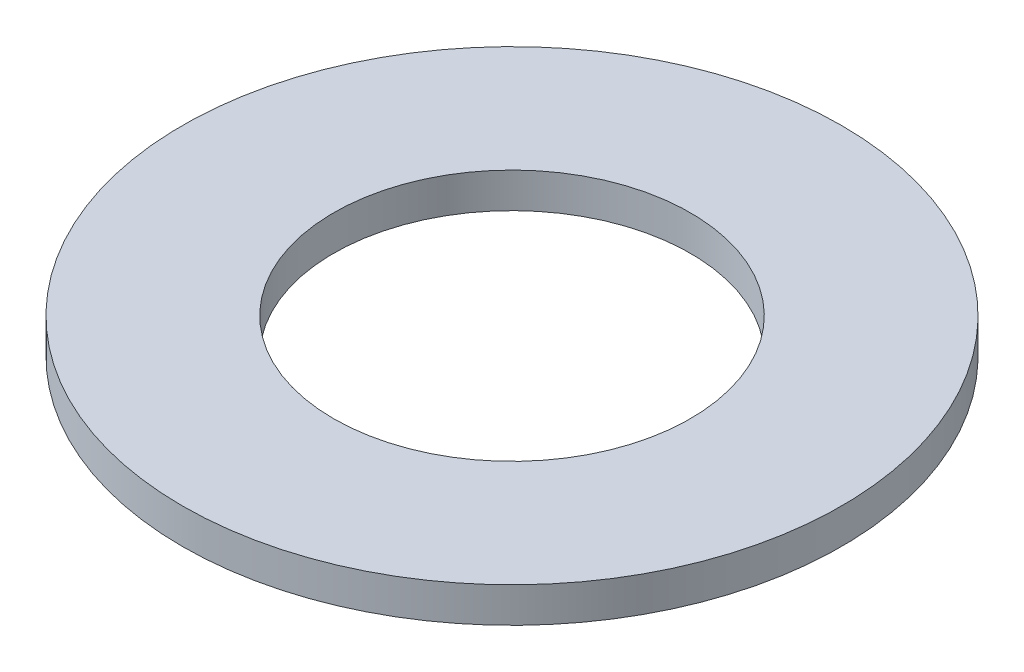
ISO-10303-21;
HEADER;
FILE_DESCRIPTION(('STEP AP214'),'2;1');
FILE_NAME('part.step','',(''),(''),'','','');
FILE_SCHEMA(('AUTOMOTIVE_DESIGN { 1 0 10303 214 1 1 1 1 }'));
ENDSEC;
DATA;
#1=APPLICATION_CONTEXT('core data for automotive mechanical design processes');
#2=APPLICATION_PROTOCOL_DEFINITION('international standard','automotive_design',2000,#1);
#3=PRODUCT_CONTEXT('',#1,'mechanical');
#4=PRODUCT('Part','Part','',(#3));
#5=PRODUCT_RELATED_PRODUCT_CATEGORY('part','',(#4));
#6=PRODUCT_DEFINITION_FORMATION('','',#4);
#7=PRODUCT_DEFINITION_CONTEXT('part definition',#1,'design');
#8=PRODUCT_DEFINITION('design','',#6,#7);
#9=PRODUCT_DEFINITION_SHAPE('','',#8);
#10=(LENGTH_UNIT() NAMED_UNIT(*) SI_UNIT(.MILLI.,.METRE.));
#11=(NAMED_UNIT(*) PLANE_ANGLE_UNIT() SI_UNIT($,.RADIAN.));
#12=(NAMED_UNIT(*) SI_UNIT($,.STERADIAN.) SOLID_ANGLE_UNIT());
#13=UNCERTAINTY_MEASURE_WITH_UNIT(LENGTH_MEASURE(1.E-05),#10,'distance_accuracy_value','');
#14=(GEOMETRIC_REPRESENTATION_CONTEXT(3) GLOBAL_UNCERTAINTY_ASSIGNED_CONTEXT((#13)) GLOBAL_UNIT_ASSIGNED_CONTEXT((#10,
#11,#12)) REPRESENTATION_CONTEXT('',''));
#15=CARTESIAN_POINT('',(0.,0.,0.));
#16=DIRECTION('',(0.,0.,1.));
#17=DIRECTION('',(1.,0.,0.));
#18=AXIS2_PLACEMENT_3D('',#15,#16,#17);
#19=CARTESIAN_POINT('',(0.,1.016,0.));
#20=DIRECTION('',(0.,-1.,0.));
#21=DIRECTION('',(0.,0.,-1.));
#22=AXIS2_PLACEMENT_3D('',#19,#20,#21);
#23=CYLINDRICAL_SURFACE('',#22,9.525);
#24=CARTESIAN_POINT('',(0.,1.016,0.));
#25=DIRECTION('',(0.,1.,0.));
#26=DIRECTION('',(0.,0.,1.));
#27=AXIS2_PLACEMENT_3D('',#24,#25,#26);
#28=CIRCLE('',#27,9.525);
#29=CARTESIAN_POINT('',(0.,1.016,9.525));
#30=VERTEX_POINT('',#29);
#31=EDGE_CURVE('E10',#30,#30,#28,.T.);
#32=ORIENTED_EDGE('',*,*,#31,.F.);
#33=EDGE_LOOP('',(#32));
#34=FACE_BOUND('',#33,.T.);
#35=CARTESIAN_POINT('',(0.,0.,0.));
#36=DIRECTION('',(0.,1.,0.));
#37=DIRECTION('',(0.,0.,1.));
#38=AXIS2_PLACEMENT_3D('',#35,#36,#37);
#39=CIRCLE('',#38,9.525);
#40=CARTESIAN_POINT('',(0.,0.,9.525));
#41=VERTEX_POINT('',#40);
#42=EDGE_CURVE('E39',#41,#41,#39,.T.);
#43=ORIENTED_EDGE('',*,*,#42,.T.);
#44=EDGE_LOOP('',(#43));
#45=FACE_BOUND('',#44,.T.);
#46=ADVANCED_FACE('F36',(#34,#45),#23,.T.);
#47=CARTESIAN_POINT('',(0.,1.016,0.));
#48=DIRECTION('',(0.,1.,0.));
#49=DIRECTION('',(0.,0.,1.));
#50=AXIS2_PLACEMENT_3D('',#47,#48,#49);
#51=PLANE('',#50);
#52=CARTESIAN_POINT('',(0.,1.016,0.));
#53=DIRECTION('',(0.,1.,0.));
#54=DIRECTION('',(0.,0.,1.));
#55=AXIS2_PLACEMENT_3D('',#52,#53,#54);
#56=CIRCLE('',#55,5.1562);
#57=CARTESIAN_POINT('',(0.,1.016,5.1562));
#58=VERTEX_POINT('',#57);
#59=EDGE_CURVE('E52',#58,#58,#56,.T.);
#60=ORIENTED_EDGE('',*,*,#59,.F.);
#61=EDGE_LOOP('',(#60));
#62=FACE_BOUND('',#61,.T.);
#63=ORIENTED_EDGE('',*,*,#31,.T.);
#64=EDGE_LOOP('',(#63));
#65=FACE_BOUND('',#64,.T.);
#66=ADVANCED_FACE('F68',(#62,#65),#51,.T.);
#67=CARTESIAN_POINT('',(0.,0.,0.));
#68=DIRECTION('',(0.,1.,0.));
#69=DIRECTION('',(0.,0.,1.));
#70=AXIS2_PLACEMENT_3D('',#67,#68,#69);
#71=PLANE('',#70);
#72=CARTESIAN_POINT('',(0.,0.,0.));
#73=DIRECTION('',(0.,1.,0.));
#74=DIRECTION('',(0.,0.,1.));
#75=AXIS2_PLACEMENT_3D('',#72,#73,#74);
#76=CIRCLE('',#75,5.1562);
#77=CARTESIAN_POINT('',(0.,0.,5.1562));
#78=VERTEX_POINT('',#77);
#79=EDGE_CURVE('E50',#78,#78,#76,.T.);
#80=ORIENTED_EDGE('',*,*,#79,.T.);
#81=EDGE_LOOP('',(#80));
#82=FACE_BOUND('',#81,.T.);
#83=ORIENTED_EDGE('',*,*,#42,.F.);
#84=EDGE_LOOP('',(#83));
#85=FACE_BOUND('',#84,.T.);
#86=ADVANCED_FACE('F59',(#82,#85),#71,.F.);
#87=CARTESIAN_POINT('',(0.,0.,0.));
#88=DIRECTION('',(0.,1.,0.));
#89=DIRECTION('',(0.,0.,1.));
#90=AXIS2_PLACEMENT_3D('',#87,#88,#89);
#91=CYLINDRICAL_SURFACE('',#90,5.1562);
#92=ORIENTED_EDGE('',*,*,#79,.F.);
#93=EDGE_LOOP('',(#92));
#94=FACE_BOUND('',#93,.T.);
#95=ORIENTED_EDGE('',*,*,#59,.T.);
#96=EDGE_LOOP('',(#95));
#97=FACE_BOUND('',#96,.T.);
#98=ADVANCED_FACE('F62',(#94,#97),#91,.F.);
#99=CLOSED_SHELL('',(#46,#66,#86,#98));
#100=MANIFOLD_SOLID_BREP('B2',#99);
#101=ADVANCED_BREP_SHAPE_REPRESENTATION('',(#18,#100),#14);
#102=SHAPE_DEFINITION_REPRESENTATION(#9,#101);
ENDSEC;
END-ISO-10303-21;
